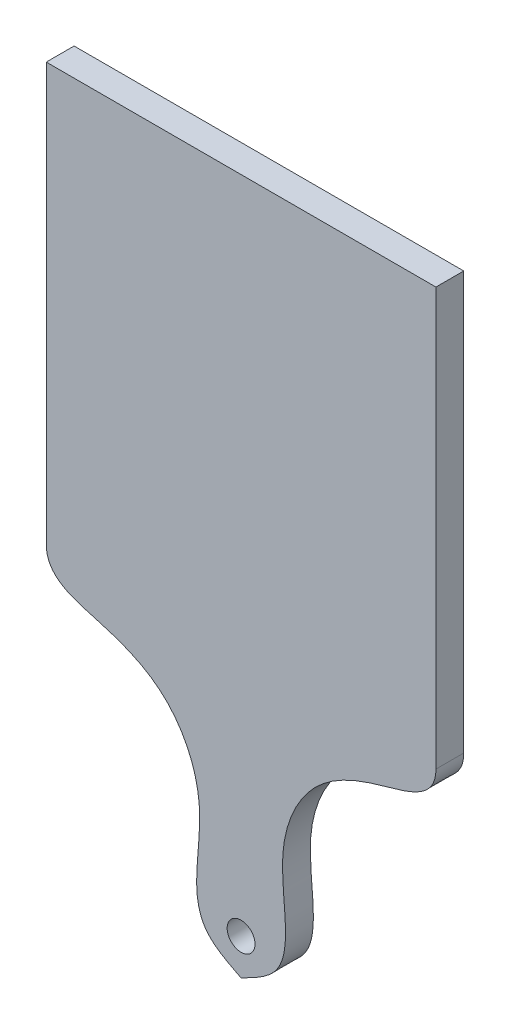
ISO-10303-21;
HEADER;
FILE_DESCRIPTION(('STEP AP214'),'2;1');
FILE_NAME('part.step','',(''),(''),'','','');
FILE_SCHEMA(('AUTOMOTIVE_DESIGN { 1 0 10303 214 1 1 1 1 }'));
ENDSEC;
DATA;
#1=APPLICATION_CONTEXT('core data for automotive mechanical design processes');
#2=APPLICATION_PROTOCOL_DEFINITION('international standard','automotive_design',2000,#1);
#3=PRODUCT_CONTEXT('',#1,'mechanical');
#4=PRODUCT('Part','Part','',(#3));
#5=PRODUCT_RELATED_PRODUCT_CATEGORY('part','',(#4));
#6=PRODUCT_DEFINITION_FORMATION('','',#4);
#7=PRODUCT_DEFINITION_CONTEXT('part definition',#1,'design');
#8=PRODUCT_DEFINITION('design','',#6,#7);
#9=PRODUCT_DEFINITION_SHAPE('','',#8);
#10=(LENGTH_UNIT() NAMED_UNIT(*) SI_UNIT(.MILLI.,.METRE.));
#11=(NAMED_UNIT(*) PLANE_ANGLE_UNIT() SI_UNIT($,.RADIAN.));
#12=(NAMED_UNIT(*) SI_UNIT($,.STERADIAN.) SOLID_ANGLE_UNIT());
#13=UNCERTAINTY_MEASURE_WITH_UNIT(LENGTH_MEASURE(1.E-05),#10,'distance_accuracy_value','');
#14=(GEOMETRIC_REPRESENTATION_CONTEXT(3) GLOBAL_UNCERTAINTY_ASSIGNED_CONTEXT((#13)) GLOBAL_UNIT_ASSIGNED_CONTEXT((#10,
#11,#12)) REPRESENTATION_CONTEXT('',''));
#15=CARTESIAN_POINT('',(0.,0.,0.));
#16=DIRECTION('',(0.,0.,1.));
#17=DIRECTION('',(1.,0.,0.));
#18=AXIS2_PLACEMENT_3D('',#15,#16,#17);
#19=CARTESIAN_POINT('',(-70.0000000000002,87.0000000000002,10.));
#20=CARTESIAN_POINT('',(-70.0000000000004,76.6477286727137,10.));
#21=CARTESIAN_POINT('',(-47.8576261794177,72.5708216061182,10.));
#22=CARTESIAN_POINT('',(-24.240732748791,61.8897477118817,10.));
#23=CARTESIAN_POINT('',(-9.90818286362404,31.1914715572274,10.));
#24=CARTESIAN_POINT('',(-21.3855281579264,-2.10738256960935,10.));
#25=CARTESIAN_POINT('',(-4.60594802775322,-10.6539821976768,10.));
#26=CARTESIAN_POINT('',(2.07202566368814E-13,-13.,10.));
#27=B_SPLINE_CURVE_WITH_KNOTS('',3,(#19,#20,#21,#22,#23,#24,#25,#26),.UNSPECIFIED.,.F.,.F.,(4,1,
1,1,1,4),(0.,0.0883300902340826,0.179989318752169,0.284383378552401,0.419062871474673,
0.470019458595526),.UNSPECIFIED.);
#28=DIRECTION('',(0.,0.,-1.));
#29=VECTOR('',#28,1.);
#30=SURFACE_OF_LINEAR_EXTRUSION('',#27,#29);
#31=CARTESIAN_POINT('',(-70.0000000000002,87.0000000000002,0.));
#32=CARTESIAN_POINT('',(-70.0000000000004,76.6477286727137,0.));
#33=CARTESIAN_POINT('',(-47.8576261794177,72.5708216061182,0.));
#34=CARTESIAN_POINT('',(-24.240732748791,61.8897477118817,0.));
#35=CARTESIAN_POINT('',(-9.90818286362404,31.1914715572274,0.));
#36=CARTESIAN_POINT('',(-21.3855281579264,-2.10738256960935,0.));
#37=CARTESIAN_POINT('',(-4.60594802775322,-10.6539821976768,0.));
#38=CARTESIAN_POINT('',(2.07202566368814E-13,-13.,0.));
#39=B_SPLINE_CURVE_WITH_KNOTS('',3,(#31,#32,#33,#34,#35,#36,#37,#38),.UNSPECIFIED.,.F.,.F.,(4,1,
1,1,1,4),(0.,0.0883300902340826,0.179989318752169,0.284383378552401,0.419062871474673,
0.470019458595526),.UNSPECIFIED.);
#40=CARTESIAN_POINT('',(-70.0000000000002,87.,0.));
#41=VERTEX_POINT('',#40);
#42=CARTESIAN_POINT('',(2.07202566368814E-13,-13.,0.));
#43=VERTEX_POINT('',#42);
#44=EDGE_CURVE('E111',#41,#43,#39,.T.);
#45=ORIENTED_EDGE('',*,*,#44,.T.);
#46=DIRECTION('',(0.,0.,-1.));
#47=VECTOR('',#46,1.);
#48=CARTESIAN_POINT('',(2.07202566368814E-13,-13.,10.));
#49=LINE('',#48,#47);
#50=CARTESIAN_POINT('',(2.07202566368814E-13,-13.,10.));
#51=VERTEX_POINT('',#50);
#52=EDGE_CURVE('E11',#51,#43,#49,.T.);
#53=ORIENTED_EDGE('',*,*,#52,.F.);
#54=CARTESIAN_POINT('',(-70.0000000000002,87.,10.));
#55=VERTEX_POINT('',#54);
#56=EDGE_CURVE('E130',#55,#51,#27,.T.);
#57=ORIENTED_EDGE('',*,*,#56,.F.);
#58=DIRECTION('',(0.,0.,-1.));
#59=VECTOR('',#58,1.);
#60=CARTESIAN_POINT('',(-70.0000000000002,87.,10.));
#61=LINE('',#60,#59);
#62=EDGE_CURVE('E107',#55,#41,#61,.T.);
#63=ORIENTED_EDGE('',*,*,#62,.T.);
#64=EDGE_LOOP('',(#45,#53,#57,#63));
#65=FACE_BOUND('',#64,.T.);
#66=ADVANCED_FACE('F36',(#65),#30,.F.);
#67=CARTESIAN_POINT('',(2.07202566368814E-13,-13.,10.));
#68=CARTESIAN_POINT('',(4.60594802775363,-10.6539821976768,10.));
#69=CARTESIAN_POINT('',(21.3855281579268,-2.10738256960934,10.));
#70=CARTESIAN_POINT('',(9.90818286362444,31.1914715572274,10.));
#71=CARTESIAN_POINT('',(24.2407327487914,61.8897477118817,10.));
#72=CARTESIAN_POINT('',(47.857626179418,72.5708216061182,10.));
#73=CARTESIAN_POINT('',(70.0000000000009,76.6477286727137,10.));
#74=CARTESIAN_POINT('',(70.0000000000008,87.0000000000002,10.));
#75=B_SPLINE_CURVE_WITH_KNOTS('',3,(#67,#68,#69,#70,#71,#72,#73,#74),.UNSPECIFIED.,.F.,.F.,(4,1,
1,1,1,4),(0.,0.0509565871208534,0.185636080043125,0.290030139843357,0.381689368361444,
0.470019458595526),.UNSPECIFIED.);
#76=DIRECTION('',(0.,0.,-1.));
#77=VECTOR('',#76,1.);
#78=SURFACE_OF_LINEAR_EXTRUSION('',#75,#77);
#79=CARTESIAN_POINT('',(2.07202566368814E-13,-13.,0.));
#80=CARTESIAN_POINT('',(4.60594802775363,-10.6539821976768,0.));
#81=CARTESIAN_POINT('',(21.3855281579268,-2.10738256960934,0.));
#82=CARTESIAN_POINT('',(9.90818286362444,31.1914715572274,0.));
#83=CARTESIAN_POINT('',(24.2407327487914,61.8897477118817,0.));
#84=CARTESIAN_POINT('',(47.857626179418,72.5708216061182,0.));
#85=CARTESIAN_POINT('',(70.0000000000009,76.6477286727137,0.));
#86=CARTESIAN_POINT('',(70.0000000000008,87.0000000000002,0.));
#87=B_SPLINE_CURVE_WITH_KNOTS('',3,(#79,#80,#81,#82,#83,#84,#85,#86),.UNSPECIFIED.,.F.,.F.,(4,1,
1,1,1,4),(0.,0.0509565871208534,0.185636080043125,0.290030139843357,0.381689368361444,
0.470019458595526),.UNSPECIFIED.);
#88=CARTESIAN_POINT('',(70.0000000000008,87.0000000000002,0.));
#89=VERTEX_POINT('',#88);
#90=EDGE_CURVE('E116',#43,#89,#87,.T.);
#91=ORIENTED_EDGE('',*,*,#90,.T.);
#92=DIRECTION('',(0.,0.,-1.));
#93=VECTOR('',#92,1.);
#94=CARTESIAN_POINT('',(70.0000000000008,87.0000000000002,10.));
#95=LINE('',#94,#93);
#96=CARTESIAN_POINT('',(70.0000000000008,87.0000000000002,10.));
#97=VERTEX_POINT('',#96);
#98=EDGE_CURVE('E45',#97,#89,#95,.T.);
#99=ORIENTED_EDGE('',*,*,#98,.F.);
#100=EDGE_CURVE('E87',#51,#97,#75,.T.);
#101=ORIENTED_EDGE('',*,*,#100,.F.);
#102=ORIENTED_EDGE('',*,*,#52,.T.);
#103=EDGE_LOOP('',(#91,#99,#101,#102));
#104=FACE_BOUND('',#103,.T.);
#105=ADVANCED_FACE('F150',(#104),#78,.F.);
#106=CARTESIAN_POINT('',(70.0000000000002,87.,10.));
#107=DIRECTION('',(-1.,0.,0.));
#108=DIRECTION('',(0.,-1.,0.));
#109=AXIS2_PLACEMENT_3D('',#106,#107,#108);
#110=PLANE('',#109);
#111=DIRECTION('',(0.,1.,0.));
#112=VECTOR('',#111,1.);
#113=CARTESIAN_POINT('',(70.0000000000002,87.,0.));
#114=LINE('',#113,#112);
#115=CARTESIAN_POINT('',(70.0000000000006,237.,0.));
#116=VERTEX_POINT('',#115);
#117=EDGE_CURVE('E102',#89,#116,#114,.T.);
#118=ORIENTED_EDGE('',*,*,#117,.T.);
#119=DIRECTION('',(0.,0.,-1.));
#120=VECTOR('',#119,1.);
#121=CARTESIAN_POINT('',(70.0000000000006,237.,10.));
#122=LINE('',#121,#120);
#123=CARTESIAN_POINT('',(70.0000000000006,237.,10.));
#124=VERTEX_POINT('',#123);
#125=EDGE_CURVE('E99',#124,#116,#122,.T.);
#126=ORIENTED_EDGE('',*,*,#125,.F.);
#127=DIRECTION('',(0.,1.,0.));
#128=VECTOR('',#127,1.);
#129=CARTESIAN_POINT('',(70.0000000000002,87.,10.));
#130=LINE('',#129,#128);
#131=EDGE_CURVE('E91',#97,#124,#130,.T.);
#132=ORIENTED_EDGE('',*,*,#131,.F.);
#133=ORIENTED_EDGE('',*,*,#98,.T.);
#134=EDGE_LOOP('',(#118,#126,#132,#133));
#135=FACE_BOUND('',#134,.T.);
#136=ADVANCED_FACE('F100',(#135),#110,.F.);
#137=CARTESIAN_POINT('',(70.0000000000006,237.,10.));
#138=DIRECTION('',(0.,-1.,0.));
#139=DIRECTION('',(1.,0.,0.));
#140=AXIS2_PLACEMENT_3D('',#137,#138,#139);
#141=PLANE('',#140);
#142=DIRECTION('',(-1.,0.,0.));
#143=VECTOR('',#142,1.);
#144=CARTESIAN_POINT('',(70.0000000000006,237.,0.));
#145=LINE('',#144,#143);
#146=CARTESIAN_POINT('',(-70.0000000000002,237.,0.));
#147=VERTEX_POINT('',#146);
#148=EDGE_CURVE('E73',#116,#147,#145,.T.);
#149=ORIENTED_EDGE('',*,*,#148,.T.);
#150=DIRECTION('',(0.,0.,-1.));
#151=VECTOR('',#150,1.);
#152=CARTESIAN_POINT('',(-70.0000000000002,237.,10.));
#153=LINE('',#152,#151);
#154=CARTESIAN_POINT('',(-70.0000000000002,237.,10.));
#155=VERTEX_POINT('',#154);
#156=EDGE_CURVE('E103',#155,#147,#153,.T.);
#157=ORIENTED_EDGE('',*,*,#156,.F.);
#158=DIRECTION('',(-1.,0.,0.));
#159=VECTOR('',#158,1.);
#160=CARTESIAN_POINT('',(70.0000000000006,237.,10.));
#161=LINE('',#160,#159);
#162=EDGE_CURVE('E95',#124,#155,#161,.T.);
#163=ORIENTED_EDGE('',*,*,#162,.F.);
#164=ORIENTED_EDGE('',*,*,#125,.T.);
#165=EDGE_LOOP('',(#149,#157,#163,#164));
#166=FACE_BOUND('',#165,.T.);
#167=ADVANCED_FACE('F105',(#166),#141,.F.);
#168=CARTESIAN_POINT('',(-70.0000000000002,87.,10.));
#169=DIRECTION('',(1.,0.,0.));
#170=DIRECTION('',(0.,0.,-1.));
#171=AXIS2_PLACEMENT_3D('',#168,#169,#170);
#172=PLANE('',#171);
#173=DIRECTION('',(0.,-1.,0.));
#174=VECTOR('',#173,1.);
#175=CARTESIAN_POINT('',(-70.0000000000002,87.,0.));
#176=LINE('',#175,#174);
#177=EDGE_CURVE('E79',#147,#41,#176,.T.);
#178=ORIENTED_EDGE('',*,*,#177,.T.);
#179=ORIENTED_EDGE('',*,*,#62,.F.);
#180=DIRECTION('',(0.,-1.,0.));
#181=VECTOR('',#180,1.);
#182=CARTESIAN_POINT('',(-70.0000000000002,87.,10.));
#183=LINE('',#182,#181);
#184=EDGE_CURVE('E53',#155,#55,#183,.T.);
#185=ORIENTED_EDGE('',*,*,#184,.F.);
#186=ORIENTED_EDGE('',*,*,#156,.T.);
#187=EDGE_LOOP('',(#178,#179,#185,#186));
#188=FACE_BOUND('',#187,.T.);
#189=ADVANCED_FACE('F138',(#188),#172,.F.);
#190=CARTESIAN_POINT('',(-18.4263874513483,47.2792220235534,10.));
#191=DIRECTION('',(0.,0.,1.));
#192=DIRECTION('',(1.,0.,0.));
#193=AXIS2_PLACEMENT_3D('',#190,#191,#192);
#194=PLANE('',#193);
#195=CARTESIAN_POINT('',(0.,0.,10.));
#196=DIRECTION('',(0.,0.,-1.));
#197=DIRECTION('',(-1.,0.,0.));
#198=AXIS2_PLACEMENT_3D('',#195,#196,#197);
#199=CIRCLE('',#198,5.);
#200=CARTESIAN_POINT('',(-5.,0.,10.));
#201=VERTEX_POINT('',#200);
#202=EDGE_CURVE('E117',#201,#201,#199,.T.);
#203=ORIENTED_EDGE('',*,*,#202,.T.);
#204=EDGE_LOOP('',(#203));
#205=FACE_BOUND('',#204,.T.);
#206=ORIENTED_EDGE('',*,*,#56,.T.);
#207=ORIENTED_EDGE('',*,*,#100,.T.);
#208=ORIENTED_EDGE('',*,*,#131,.T.);
#209=ORIENTED_EDGE('',*,*,#162,.T.);
#210=ORIENTED_EDGE('',*,*,#184,.T.);
#211=EDGE_LOOP('',(#206,#207,#208,#209,#210));
#212=FACE_BOUND('',#211,.T.);
#213=ADVANCED_FACE('F93',(#205,#212),#194,.T.);
#214=CARTESIAN_POINT('',(-18.4263874513483,47.2792220235534,0.));
#215=DIRECTION('',(0.,0.,1.));
#216=DIRECTION('',(1.,0.,0.));
#217=AXIS2_PLACEMENT_3D('',#214,#215,#216);
#218=PLANE('',#217);
#219=CARTESIAN_POINT('',(0.,0.,0.));
#220=DIRECTION('',(0.,0.,-1.));
#221=DIRECTION('',(-1.,0.,0.));
#222=AXIS2_PLACEMENT_3D('',#219,#220,#221);
#223=CIRCLE('',#222,5.);
#224=CARTESIAN_POINT('',(-5.,0.,0.));
#225=VERTEX_POINT('',#224);
#226=EDGE_CURVE('E168',#225,#225,#223,.T.);
#227=ORIENTED_EDGE('',*,*,#226,.F.);
#228=EDGE_LOOP('',(#227));
#229=FACE_BOUND('',#228,.T.);
#230=ORIENTED_EDGE('',*,*,#44,.F.);
#231=ORIENTED_EDGE('',*,*,#177,.F.);
#232=ORIENTED_EDGE('',*,*,#148,.F.);
#233=ORIENTED_EDGE('',*,*,#117,.F.);
#234=ORIENTED_EDGE('',*,*,#90,.F.);
#235=EDGE_LOOP('',(#230,#231,#232,#233,#234));
#236=FACE_BOUND('',#235,.T.);
#237=ADVANCED_FACE('F134',(#229,#236),#218,.F.);
#238=CARTESIAN_POINT('',(0.,0.,10.));
#239=DIRECTION('',(0.,0.,-1.));
#240=DIRECTION('',(-1.,0.,0.));
#241=AXIS2_PLACEMENT_3D('',#238,#239,#240);
#242=CYLINDRICAL_SURFACE('',#241,5.);
#243=ORIENTED_EDGE('',*,*,#202,.F.);
#244=EDGE_LOOP('',(#243));
#245=FACE_BOUND('',#244,.T.);
#246=ORIENTED_EDGE('',*,*,#226,.T.);
#247=EDGE_LOOP('',(#246));
#248=FACE_BOUND('',#247,.T.);
#249=ADVANCED_FACE('F177',(#245,#248),#242,.F.);
#250=CLOSED_SHELL('',(#66,#105,#136,#167,#189,#213,#237,#249));
#251=MANIFOLD_SOLID_BREP('B2',#250);
#252=ADVANCED_BREP_SHAPE_REPRESENTATION('',(#18,#251),#14);
#253=SHAPE_DEFINITION_REPRESENTATION(#9,#252);
ENDSEC;
END-ISO-10303-21;
